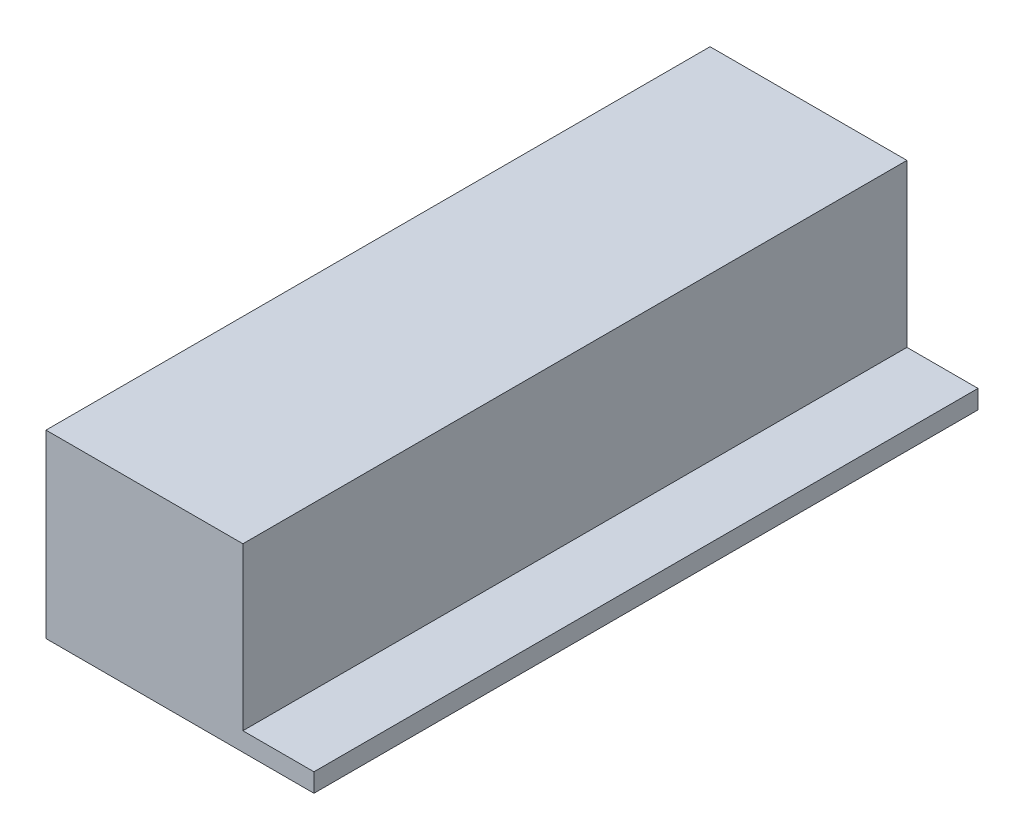
ISO-10303-21;
HEADER;
FILE_DESCRIPTION(('STEP AP214'),'2;1');
FILE_NAME('part.step','',(''),(''),'','','');
FILE_SCHEMA(('AUTOMOTIVE_DESIGN { 1 0 10303 214 1 1 1 1 }'));
ENDSEC;
DATA;
#1=APPLICATION_CONTEXT('core data for automotive mechanical design processes');
#2=APPLICATION_PROTOCOL_DEFINITION('international standard','automotive_design',2000,#1);
#3=PRODUCT_CONTEXT('',#1,'mechanical');
#4=PRODUCT('Part','Part','',(#3));
#5=PRODUCT_RELATED_PRODUCT_CATEGORY('part','',(#4));
#6=PRODUCT_DEFINITION_FORMATION('','',#4);
#7=PRODUCT_DEFINITION_CONTEXT('part definition',#1,'design');
#8=PRODUCT_DEFINITION('design','',#6,#7);
#9=PRODUCT_DEFINITION_SHAPE('','',#8);
#10=(LENGTH_UNIT() NAMED_UNIT(*) SI_UNIT(.MILLI.,.METRE.));
#11=(NAMED_UNIT(*) PLANE_ANGLE_UNIT() SI_UNIT($,.RADIAN.));
#12=(NAMED_UNIT(*) SI_UNIT($,.STERADIAN.) SOLID_ANGLE_UNIT());
#13=UNCERTAINTY_MEASURE_WITH_UNIT(LENGTH_MEASURE(1.E-05),#10,'distance_accuracy_value','');
#14=(GEOMETRIC_REPRESENTATION_CONTEXT(3) GLOBAL_UNCERTAINTY_ASSIGNED_CONTEXT((#13)) GLOBAL_UNIT_ASSIGNED_CONTEXT((#10,
#11,#12)) REPRESENTATION_CONTEXT('',''));
#15=CARTESIAN_POINT('',(0.,0.,0.));
#16=DIRECTION('',(0.,0.,1.));
#17=DIRECTION('',(1.,0.,0.));
#18=AXIS2_PLACEMENT_3D('',#15,#16,#17);
#19=CARTESIAN_POINT('',(0.,15.5,57.));
#20=DIRECTION('',(1.,0.,0.));
#21=DIRECTION('',(0.,0.,-1.));
#22=AXIS2_PLACEMENT_3D('',#19,#20,#21);
#23=PLANE('',#22);
#24=DIRECTION('',(0.,-1.,0.));
#25=VECTOR('',#24,1.);
#26=CARTESIAN_POINT('',(0.,15.5,0.));
#27=LINE('',#26,#25);
#28=CARTESIAN_POINT('',(0.,15.5,0.));
#29=VERTEX_POINT('',#28);
#30=CARTESIAN_POINT('',(0.,0.,0.));
#31=VERTEX_POINT('',#30);
#32=EDGE_CURVE('E119',#29,#31,#27,.T.);
#33=ORIENTED_EDGE('',*,*,#32,.T.);
#34=DIRECTION('',(0.,0.,-1.));
#35=VECTOR('',#34,1.);
#36=CARTESIAN_POINT('',(0.,0.,57.));
#37=LINE('',#36,#35);
#38=CARTESIAN_POINT('',(0.,0.,57.));
#39=VERTEX_POINT('',#38);
#40=EDGE_CURVE('E11',#39,#31,#37,.T.);
#41=ORIENTED_EDGE('',*,*,#40,.F.);
#42=DIRECTION('',(0.,-1.,0.));
#43=VECTOR('',#42,1.);
#44=CARTESIAN_POINT('',(0.,15.5,57.));
#45=LINE('',#44,#43);
#46=CARTESIAN_POINT('',(0.,15.5,57.));
#47=VERTEX_POINT('',#46);
#48=EDGE_CURVE('E129',#47,#39,#45,.T.);
#49=ORIENTED_EDGE('',*,*,#48,.F.);
#50=DIRECTION('',(0.,0.,-1.));
#51=VECTOR('',#50,1.);
#52=CARTESIAN_POINT('',(0.,15.5,57.));
#53=LINE('',#52,#51);
#54=EDGE_CURVE('E115',#47,#29,#53,.T.);
#55=ORIENTED_EDGE('',*,*,#54,.T.);
#56=EDGE_LOOP('',(#33,#41,#49,#55));
#57=FACE_BOUND('',#56,.T.);
#58=ADVANCED_FACE('F35',(#57),#23,.F.);
#59=CARTESIAN_POINT('',(0.,0.,57.));
#60=DIRECTION('',(0.,1.,0.));
#61=DIRECTION('',(0.,0.,1.));
#62=AXIS2_PLACEMENT_3D('',#59,#60,#61);
#63=PLANE('',#62);
#64=DIRECTION('',(1.,0.,0.));
#65=VECTOR('',#64,1.);
#66=CARTESIAN_POINT('',(0.,0.,0.));
#67=LINE('',#66,#65);
#68=CARTESIAN_POINT('',(23.,0.,0.));
#69=VERTEX_POINT('',#68);
#70=EDGE_CURVE('E122',#31,#69,#67,.T.);
#71=ORIENTED_EDGE('',*,*,#70,.T.);
#72=DIRECTION('',(0.,0.,-1.));
#73=VECTOR('',#72,1.);
#74=CARTESIAN_POINT('',(23.,0.,57.));
#75=LINE('',#74,#73);
#76=CARTESIAN_POINT('',(23.,0.,57.));
#77=VERTEX_POINT('',#76);
#78=EDGE_CURVE('E43',#77,#69,#75,.T.);
#79=ORIENTED_EDGE('',*,*,#78,.F.);
#80=DIRECTION('',(1.,0.,0.));
#81=VECTOR('',#80,1.);
#82=CARTESIAN_POINT('',(0.,0.,57.));
#83=LINE('',#82,#81);
#84=EDGE_CURVE('E88',#39,#77,#83,.T.);
#85=ORIENTED_EDGE('',*,*,#84,.F.);
#86=ORIENTED_EDGE('',*,*,#40,.T.);
#87=EDGE_LOOP('',(#71,#79,#85,#86));
#88=FACE_BOUND('',#87,.T.);
#89=ADVANCED_FACE('F153',(#88),#63,.F.);
#90=CARTESIAN_POINT('',(23.,0.,57.));
#91=DIRECTION('',(-1.,0.,0.));
#92=DIRECTION('',(0.,0.,1.));
#93=AXIS2_PLACEMENT_3D('',#90,#91,#92);
#94=PLANE('',#93);
#95=DIRECTION('',(0.,1.,0.));
#96=VECTOR('',#95,1.);
#97=CARTESIAN_POINT('',(23.,0.,0.));
#98=LINE('',#97,#96);
#99=CARTESIAN_POINT('',(23.,1.6,0.));
#100=VERTEX_POINT('',#99);
#101=EDGE_CURVE('E124',#69,#100,#98,.T.);
#102=ORIENTED_EDGE('',*,*,#101,.T.);
#103=DIRECTION('',(0.,0.,-1.));
#104=VECTOR('',#103,1.);
#105=CARTESIAN_POINT('',(23.,1.6,57.));
#106=LINE('',#105,#104);
#107=CARTESIAN_POINT('',(23.,1.6,57.));
#108=VERTEX_POINT('',#107);
#109=EDGE_CURVE('E110',#108,#100,#106,.T.);
#110=ORIENTED_EDGE('',*,*,#109,.F.);
#111=DIRECTION('',(0.,1.,0.));
#112=VECTOR('',#111,1.);
#113=CARTESIAN_POINT('',(23.,0.,57.));
#114=LINE('',#113,#112);
#115=EDGE_CURVE('E101',#77,#108,#114,.T.);
#116=ORIENTED_EDGE('',*,*,#115,.F.);
#117=ORIENTED_EDGE('',*,*,#78,.T.);
#118=EDGE_LOOP('',(#102,#110,#116,#117));
#119=FACE_BOUND('',#118,.T.);
#120=ADVANCED_FACE('F135',(#119),#94,.F.);
#121=CARTESIAN_POINT('',(23.,1.6,57.));
#122=DIRECTION('',(0.,-1.,0.));
#123=DIRECTION('',(1.,0.,0.));
#124=AXIS2_PLACEMENT_3D('',#121,#122,#123);
#125=PLANE('',#124);
#126=DIRECTION('',(-1.,0.,0.));
#127=VECTOR('',#126,1.);
#128=CARTESIAN_POINT('',(23.,1.6,0.));
#129=LINE('',#128,#127);
#130=CARTESIAN_POINT('',(16.9,1.6,0.));
#131=VERTEX_POINT('',#130);
#132=EDGE_CURVE('E109',#100,#131,#129,.T.);
#133=ORIENTED_EDGE('',*,*,#132,.T.);
#134=DIRECTION('',(0.,0.,-1.));
#135=VECTOR('',#134,1.);
#136=CARTESIAN_POINT('',(16.9,1.6,57.));
#137=LINE('',#136,#135);
#138=CARTESIAN_POINT('',(16.9,1.6,57.));
#139=VERTEX_POINT('',#138);
#140=EDGE_CURVE('E106',#139,#131,#137,.T.);
#141=ORIENTED_EDGE('',*,*,#140,.F.);
#142=DIRECTION('',(-1.,0.,0.));
#143=VECTOR('',#142,1.);
#144=CARTESIAN_POINT('',(23.,1.6,57.));
#145=LINE('',#144,#143);
#146=EDGE_CURVE('E95',#108,#139,#145,.T.);
#147=ORIENTED_EDGE('',*,*,#146,.F.);
#148=ORIENTED_EDGE('',*,*,#109,.T.);
#149=EDGE_LOOP('',(#133,#141,#147,#148));
#150=FACE_BOUND('',#149,.T.);
#151=ADVANCED_FACE('F107',(#150),#125,.F.);
#152=CARTESIAN_POINT('',(16.9,1.6,57.));
#153=DIRECTION('',(-1.,0.,0.));
#154=DIRECTION('',(0.,0.,1.));
#155=AXIS2_PLACEMENT_3D('',#152,#153,#154);
#156=PLANE('',#155);
#157=DIRECTION('',(0.,1.,0.));
#158=VECTOR('',#157,1.);
#159=CARTESIAN_POINT('',(16.9,1.6,0.));
#160=LINE('',#159,#158);
#161=CARTESIAN_POINT('',(16.9,15.5,0.));
#162=VERTEX_POINT('',#161);
#163=EDGE_CURVE('E74',#131,#162,#160,.T.);
#164=ORIENTED_EDGE('',*,*,#163,.T.);
#165=DIRECTION('',(0.,0.,-1.));
#166=VECTOR('',#165,1.);
#167=CARTESIAN_POINT('',(16.9,15.5,57.));
#168=LINE('',#167,#166);
#169=CARTESIAN_POINT('',(16.9,15.5,57.));
#170=VERTEX_POINT('',#169);
#171=EDGE_CURVE('E111',#170,#162,#168,.T.);
#172=ORIENTED_EDGE('',*,*,#171,.F.);
#173=DIRECTION('',(0.,1.,0.));
#174=VECTOR('',#173,1.);
#175=CARTESIAN_POINT('',(16.9,1.6,57.));
#176=LINE('',#175,#174);
#177=EDGE_CURVE('E99',#139,#170,#176,.T.);
#178=ORIENTED_EDGE('',*,*,#177,.F.);
#179=ORIENTED_EDGE('',*,*,#140,.T.);
#180=EDGE_LOOP('',(#164,#172,#178,#179));
#181=FACE_BOUND('',#180,.T.);
#182=ADVANCED_FACE('F113',(#181),#156,.F.);
#183=CARTESIAN_POINT('',(16.9,15.5,57.));
#184=DIRECTION('',(0.,-1.,0.));
#185=DIRECTION('',(1.,0.,0.));
#186=AXIS2_PLACEMENT_3D('',#183,#184,#185);
#187=PLANE('',#186);
#188=DIRECTION('',(-1.,0.,0.));
#189=VECTOR('',#188,1.);
#190=CARTESIAN_POINT('',(16.9,15.5,0.));
#191=LINE('',#190,#189);
#192=EDGE_CURVE('E80',#162,#29,#191,.T.);
#193=ORIENTED_EDGE('',*,*,#192,.T.);
#194=ORIENTED_EDGE('',*,*,#54,.F.);
#195=DIRECTION('',(-1.,0.,0.));
#196=VECTOR('',#195,1.);
#197=CARTESIAN_POINT('',(16.9,15.5,57.));
#198=LINE('',#197,#196);
#199=EDGE_CURVE('E51',#170,#47,#198,.T.);
#200=ORIENTED_EDGE('',*,*,#199,.F.);
#201=ORIENTED_EDGE('',*,*,#171,.T.);
#202=EDGE_LOOP('',(#193,#194,#200,#201));
#203=FACE_BOUND('',#202,.T.);
#204=ADVANCED_FACE('F142',(#203),#187,.F.);
#205=CARTESIAN_POINT('',(0.,0.,57.));
#206=DIRECTION('',(0.,0.,1.));
#207=DIRECTION('',(1.,0.,0.));
#208=AXIS2_PLACEMENT_3D('',#205,#206,#207);
#209=PLANE('',#208);
#210=ORIENTED_EDGE('',*,*,#48,.T.);
#211=ORIENTED_EDGE('',*,*,#84,.T.);
#212=ORIENTED_EDGE('',*,*,#115,.T.);
#213=ORIENTED_EDGE('',*,*,#146,.T.);
#214=ORIENTED_EDGE('',*,*,#177,.T.);
#215=ORIENTED_EDGE('',*,*,#199,.T.);
#216=EDGE_LOOP('',(#210,#211,#212,#213,#214,#215));
#217=FACE_BOUND('',#216,.T.);
#218=ADVANCED_FACE('F97',(#217),#209,.T.);
#219=CARTESIAN_POINT('',(0.,0.,0.));
#220=DIRECTION('',(0.,0.,1.));
#221=DIRECTION('',(1.,0.,0.));
#222=AXIS2_PLACEMENT_3D('',#219,#220,#221);
#223=PLANE('',#222);
#224=ORIENTED_EDGE('',*,*,#32,.F.);
#225=ORIENTED_EDGE('',*,*,#192,.F.);
#226=ORIENTED_EDGE('',*,*,#163,.F.);
#227=ORIENTED_EDGE('',*,*,#132,.F.);
#228=ORIENTED_EDGE('',*,*,#101,.F.);
#229=ORIENTED_EDGE('',*,*,#70,.F.);
#230=EDGE_LOOP('',(#224,#225,#226,#227,#228,#229));
#231=FACE_BOUND('',#230,.T.);
#232=ADVANCED_FACE('F138',(#231),#223,.F.);
#233=CLOSED_SHELL('',(#58,#89,#120,#151,#182,#204,#218,#232));
#234=MANIFOLD_SOLID_BREP('B2',#233);
#235=ADVANCED_BREP_SHAPE_REPRESENTATION('',(#18,#234),#14);
#236=SHAPE_DEFINITION_REPRESENTATION(#9,#235);
ENDSEC;
END-ISO-10303-21;
